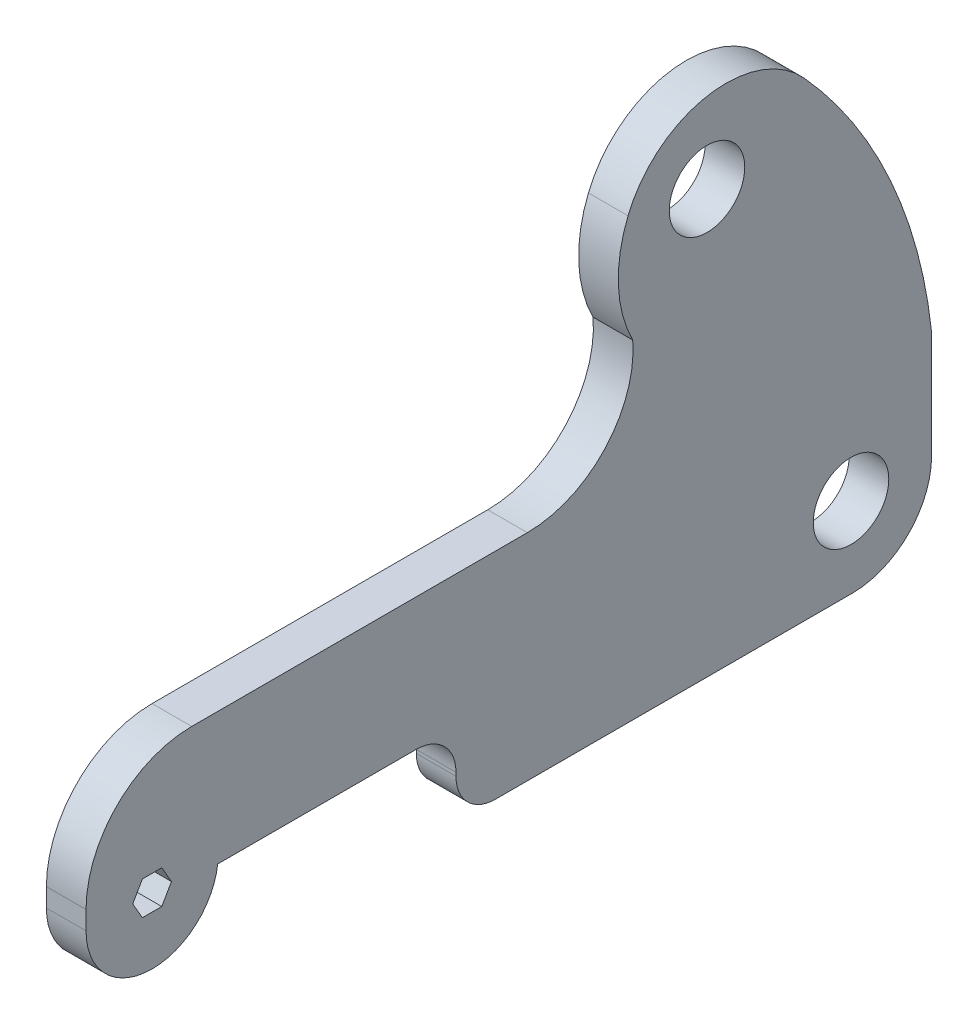
ISO-10303-21;
HEADER;
FILE_DESCRIPTION(('STEP AP214'),'2;1');
FILE_NAME('part.step','',(''),(''),'','','');
FILE_SCHEMA(('AUTOMOTIVE_DESIGN { 1 0 10303 214 1 1 1 1 }'));
ENDSEC;
DATA;
#1=APPLICATION_CONTEXT('core data for automotive mechanical design processes');
#2=APPLICATION_PROTOCOL_DEFINITION('international standard','automotive_design',2000,#1);
#3=PRODUCT_CONTEXT('',#1,'mechanical');
#4=PRODUCT('Part','Part','',(#3));
#5=PRODUCT_RELATED_PRODUCT_CATEGORY('part','',(#4));
#6=PRODUCT_DEFINITION_FORMATION('','',#4);
#7=PRODUCT_DEFINITION_CONTEXT('part definition',#1,'design');
#8=PRODUCT_DEFINITION('design','',#6,#7);
#9=PRODUCT_DEFINITION_SHAPE('','',#8);
#10=(LENGTH_UNIT() NAMED_UNIT(*) SI_UNIT(.MILLI.,.METRE.));
#11=(NAMED_UNIT(*) PLANE_ANGLE_UNIT() SI_UNIT($,.RADIAN.));
#12=(NAMED_UNIT(*) SI_UNIT($,.STERADIAN.) SOLID_ANGLE_UNIT());
#13=UNCERTAINTY_MEASURE_WITH_UNIT(LENGTH_MEASURE(1.E-05),#10,'distance_accuracy_value','');
#14=(GEOMETRIC_REPRESENTATION_CONTEXT(3) GLOBAL_UNCERTAINTY_ASSIGNED_CONTEXT((#13)) GLOBAL_UNIT_ASSIGNED_CONTEXT((#10,
#11,#12)) REPRESENTATION_CONTEXT('',''));
#15=CARTESIAN_POINT('',(0.,0.,0.));
#16=DIRECTION('',(0.,0.,1.));
#17=DIRECTION('',(1.,0.,0.));
#18=AXIS2_PLACEMENT_3D('',#15,#16,#17);
#19=CARTESIAN_POINT('',(15.,25.4000000000001,-90.));
#20=DIRECTION('',(1.,0.,0.));
#21=DIRECTION('',(0.,0.,-1.));
#22=AXIS2_PLACEMENT_3D('',#19,#20,#21);
#23=PLANE('',#22);
#24=DIRECTION('',(0.,0.866025403784439,0.499999999999999));
#25=VECTOR('',#24,1.);
#26=CARTESIAN_POINT('',(15.,19.05,-86.3338257906459));
#27=LINE('',#26,#25);
#28=CARTESIAN_POINT('',(15.,19.05,-86.3338257906459));
#29=VERTEX_POINT('',#28);
#30=CARTESIAN_POINT('',(15.,25.4,-82.6676515812918));
#31=VERTEX_POINT('',#30);
#32=EDGE_CURVE('E292',#29,#31,#27,.T.);
#33=ORIENTED_EDGE('',*,*,#32,.T.);
#34=DIRECTION('',(0.,0.866025403784439,-0.5));
#35=VECTOR('',#34,1.);
#36=CARTESIAN_POINT('',(15.,25.4,-82.6676515812918));
#37=LINE('',#36,#35);
#38=CARTESIAN_POINT('',(15.,31.75,-86.3338257906459));
#39=VERTEX_POINT('',#38);
#40=EDGE_CURVE('E295',#31,#39,#37,.T.);
#41=ORIENTED_EDGE('',*,*,#40,.T.);
#42=DIRECTION('',(0.,0.,-1.));
#43=VECTOR('',#42,1.);
#44=CARTESIAN_POINT('',(15.,31.75,-86.3338257906459));
#45=LINE('',#44,#43);
#46=CARTESIAN_POINT('',(15.,31.75,-93.6661742093541));
#47=VERTEX_POINT('',#46);
#48=EDGE_CURVE('E299',#39,#47,#45,.T.);
#49=ORIENTED_EDGE('',*,*,#48,.T.);
#50=DIRECTION('',(0.,-0.866025403784439,-0.5));
#51=VECTOR('',#50,1.);
#52=CARTESIAN_POINT('',(15.,31.75,-93.6661742093541));
#53=LINE('',#52,#51);
#54=CARTESIAN_POINT('',(15.,25.4,-97.3323484187082));
#55=VERTEX_POINT('',#54);
#56=EDGE_CURVE('E302',#47,#55,#53,.T.);
#57=ORIENTED_EDGE('',*,*,#56,.T.);
#58=DIRECTION('',(0.,-0.866025403784439,0.5));
#59=VECTOR('',#58,1.);
#60=CARTESIAN_POINT('',(15.,25.4,-97.3323484187082));
#61=LINE('',#60,#59);
#62=CARTESIAN_POINT('',(15.,19.05,-93.6661742093541));
#63=VERTEX_POINT('',#62);
#64=EDGE_CURVE('E305',#55,#63,#61,.T.);
#65=ORIENTED_EDGE('',*,*,#64,.T.);
#66=DIRECTION('',(0.,0.,1.));
#67=VECTOR('',#66,1.);
#68=CARTESIAN_POINT('',(15.,19.05,-93.6661742093541));
#69=LINE('',#68,#67);
#70=EDGE_CURVE('E308',#63,#29,#69,.T.);
#71=ORIENTED_EDGE('',*,*,#70,.T.);
#72=EDGE_LOOP('',(#33,#41,#49,#57,#65,#71));
#73=FACE_BOUND('',#72,.T.);
#74=CARTESIAN_POINT('',(15.,21.5616228227509,-354.499999997544));
#75=DIRECTION('',(1.,0.,0.));
#76=DIRECTION('',(0.,0.,-1.));
#77=AXIS2_PLACEMENT_3D('',#74,#75,#76);
#78=CIRCLE('',#77,14.29);
#79=CARTESIAN_POINT('',(15.,21.5616228227509,-368.789999997544));
#80=VERTEX_POINT('',#79);
#81=EDGE_CURVE('E246',#80,#80,#78,.T.);
#82=ORIENTED_EDGE('',*,*,#81,.F.);
#83=EDGE_LOOP('',(#82));
#84=FACE_BOUND('',#83,.T.);
#85=CARTESIAN_POINT('',(15.,151.061622822751,-299.999999997544));
#86=DIRECTION('',(1.,0.,0.));
#87=DIRECTION('',(0.,0.,-1.));
#88=AXIS2_PLACEMENT_3D('',#85,#86,#87);
#89=CIRCLE('',#88,14.2899999999392);
#90=CARTESIAN_POINT('',(15.,151.061622822751,-314.289999997483));
#91=VERTEX_POINT('',#90);
#92=EDGE_CURVE('E247',#91,#91,#89,.T.);
#93=ORIENTED_EDGE('',*,*,#92,.F.);
#94=EDGE_LOOP('',(#93));
#95=FACE_BOUND('',#94,.T.);
#96=CARTESIAN_POINT('',(15.,41.3040957016978,-196.081387122301));
#97=DIRECTION('',(-1.,0.,0.));
#98=DIRECTION('',(0.,0.,-1.));
#99=AXIS2_PLACEMENT_3D('',#96,#97,#98);
#100=CIRCLE('',#99,190.);
#101=CARTESIAN_POINT('',(15.,168.987268489218,-336.783225727603));
#102=VERTEX_POINT('',#101);
#103=CARTESIAN_POINT('',(15.,61.5516614753933,-384.999454231405));
#104=VERTEX_POINT('',#103);
#105=EDGE_CURVE('E188',#102,#104,#100,.T.);
#106=ORIENTED_EDGE('',*,*,#105,.F.);
#107=CARTESIAN_POINT('',(15.,142.106600533951,-307.161786021224));
#108=DIRECTION('',(1.,0.,0.));
#109=DIRECTION('',(0.,0.,-1.));
#110=AXIS2_PLACEMENT_3D('',#107,#108,#109);
#111=CIRCLE('',#110,40.);
#112=CARTESIAN_POINT('',(15.,157.195602297835,-270.116920982065));
#113=VERTEX_POINT('',#112);
#114=EDGE_CURVE('E61',#102,#113,#111,.T.);
#115=ORIENTED_EDGE('',*,*,#114,.T.);
#116=CARTESIAN_POINT('',(15.,138.33435009298,-316.423002281013));
#117=DIRECTION('',(-1.,0.,0.));
#118=DIRECTION('',(0.,0.,1.));
#119=AXIS2_PLACEMENT_3D('',#116,#117,#118);
#120=CIRCLE('',#119,50.);
#121=CARTESIAN_POINT('',(15.,115.607077365959,-271.886825139372));
#122=VERTEX_POINT('',#121);
#123=EDGE_CURVE('E283',#122,#113,#120,.T.);
#124=ORIENTED_EDGE('',*,*,#123,.F.);
#125=CARTESIAN_POINT('',(15.,112.4,-232.015599239373));
#126=DIRECTION('',(1.,0.,0.));
#127=DIRECTION('',(0.,0.,-1.));
#128=AXIS2_PLACEMENT_3D('',#125,#126,#127);
#129=CIRCLE('',#128,40.);
#130=CARTESIAN_POINT('',(15.,72.4,-232.015599239373));
#131=VERTEX_POINT('',#130);
#132=EDGE_CURVE('E258',#122,#131,#129,.F.);
#133=ORIENTED_EDGE('',*,*,#132,.T.);
#134=DIRECTION('',(0.,0.,-1.));
#135=VECTOR('',#134,1.);
#136=CARTESIAN_POINT('',(15.,72.4,-65.));
#137=LINE('',#136,#135);
#138=CARTESIAN_POINT('',(15.,72.4,-105.));
#139=VERTEX_POINT('',#138);
#140=EDGE_CURVE('E205',#139,#131,#137,.T.);
#141=ORIENTED_EDGE('',*,*,#140,.F.);
#142=CARTESIAN_POINT('',(15.,32.4000000000001,-105.));
#143=DIRECTION('',(1.,0.,0.));
#144=DIRECTION('',(0.,0.,-1.));
#145=AXIS2_PLACEMENT_3D('',#142,#143,#144);
#146=CIRCLE('',#145,40.);
#147=CARTESIAN_POINT('',(15.,32.4000000000001,-65.));
#148=VERTEX_POINT('',#147);
#149=EDGE_CURVE('E252',#139,#148,#146,.T.);
#150=ORIENTED_EDGE('',*,*,#149,.T.);
#151=DIRECTION('',(0.,1.,0.));
#152=VECTOR('',#151,1.);
#153=CARTESIAN_POINT('',(15.,25.4,-65.));
#154=LINE('',#153,#152);
#155=CARTESIAN_POINT('',(15.,25.4,-65.));
#156=VERTEX_POINT('',#155);
#157=EDGE_CURVE('E353',#156,#148,#154,.T.);
#158=ORIENTED_EDGE('',*,*,#157,.F.);
#159=CARTESIAN_POINT('',(15.,25.4000000000001,-90.));
#160=DIRECTION('',(1.,0.,0.));
#161=DIRECTION('',(0.,0.,-1.));
#162=AXIS2_PLACEMENT_3D('',#159,#160,#161);
#163=CIRCLE('',#162,25.);
#164=CARTESIAN_POINT('',(15.,22.4000000000001,-114.819347291982));
#165=VERTEX_POINT('',#164);
#166=EDGE_CURVE('E340',#156,#165,#163,.T.);
#167=ORIENTED_EDGE('',*,*,#166,.T.);
#168=DIRECTION('',(0.,0.,1.));
#169=VECTOR('',#168,1.);
#170=CARTESIAN_POINT('',(15.,22.4000000000001,-115.));
#171=LINE('',#170,#169);
#172=CARTESIAN_POINT('',(15.,22.4000000000001,-190.));
#173=VERTEX_POINT('',#172);
#174=EDGE_CURVE('E343',#173,#165,#171,.T.);
#175=ORIENTED_EDGE('',*,*,#174,.F.);
#176=CARTESIAN_POINT('',(15.,7.40000000000005,-190.));
#177=DIRECTION('',(1.,0.,0.));
#178=DIRECTION('',(0.,0.,-1.));
#179=AXIS2_PLACEMENT_3D('',#176,#177,#178);
#180=CIRCLE('',#179,15.);
#181=CARTESIAN_POINT('',(15.,7.40000000000005,-205.));
#182=VERTEX_POINT('',#181);
#183=EDGE_CURVE('E231',#173,#182,#180,.F.);
#184=ORIENTED_EDGE('',*,*,#183,.T.);
#185=DIRECTION('',(0.,-1.,0.));
#186=VECTOR('',#185,1.);
#187=CARTESIAN_POINT('',(15.,22.4000000000001,-205.));
#188=LINE('',#187,#186);
#189=CARTESIAN_POINT('',(15.,6.06162282000004,-205.));
#190=VERTEX_POINT('',#189);
#191=EDGE_CURVE('E346',#182,#190,#188,.T.);
#192=ORIENTED_EDGE('',*,*,#191,.T.);
#193=CARTESIAN_POINT('',(15.,6.06162282000004,-220.));
#194=DIRECTION('',(1.,0.,0.));
#195=DIRECTION('',(0.,0.,-1.));
#196=AXIS2_PLACEMENT_3D('',#193,#194,#195);
#197=CIRCLE('',#196,15.);
#198=CARTESIAN_POINT('',(15.,-8.93837717999996,-220.));
#199=VERTEX_POINT('',#198);
#200=EDGE_CURVE('E227',#190,#199,#197,.T.);
#201=ORIENTED_EDGE('',*,*,#200,.T.);
#202=DIRECTION('',(0.,0.,-1.));
#203=VECTOR('',#202,1.);
#204=CARTESIAN_POINT('',(15.,-8.93837717999996,-205.));
#205=LINE('',#204,#203);
#206=CARTESIAN_POINT('',(15.,-8.93837717999996,-355.));
#207=VERTEX_POINT('',#206);
#208=EDGE_CURVE('E349',#199,#207,#205,.T.);
#209=ORIENTED_EDGE('',*,*,#208,.T.);
#210=CARTESIAN_POINT('',(15.,21.06162282,-355.));
#211=DIRECTION('',(1.,0.,0.));
#212=DIRECTION('',(0.,0.,-1.));
#213=AXIS2_PLACEMENT_3D('',#210,#211,#212);
#214=CIRCLE('',#213,30.);
#215=CARTESIAN_POINT('',(15.,21.06162282,-385.));
#216=VERTEX_POINT('',#215);
#217=EDGE_CURVE('E240',#207,#216,#214,.T.);
#218=ORIENTED_EDGE('',*,*,#217,.T.);
#219=DIRECTION('',(0.,-1.,0.));
#220=VECTOR('',#219,1.);
#221=CARTESIAN_POINT('',(15.,281.06162282,-385.));
#222=LINE('',#221,#220);
#223=CARTESIAN_POINT('',(15.,61.0616228200001,-385.));
#224=VERTEX_POINT('',#223);
#225=EDGE_CURVE('E209',#224,#216,#222,.T.);
#226=ORIENTED_EDGE('',*,*,#225,.F.);
#227=CARTESIAN_POINT('',(15.,61.06162282,-165.));
#228=DIRECTION('',(1.,0.,0.));
#229=DIRECTION('',(0.,0.,-1.));
#230=AXIS2_PLACEMENT_3D('',#227,#228,#229);
#231=CIRCLE('',#230,220.);
#232=EDGE_CURVE('E203',#224,#104,#231,.T.);
#233=ORIENTED_EDGE('',*,*,#232,.T.);
#234=EDGE_LOOP('',(#106,#115,#124,#133,#141,#150,#158,#167,#175,#184,#192,#201,#209,#218,#226,#233));
#235=FACE_BOUND('',#234,.T.);
#236=ADVANCED_FACE('F39',(#73,#84,#95,#235),#23,.T.);
#237=CARTESIAN_POINT('',(0.,25.4000000000001,-90.));
#238=DIRECTION('',(1.,0.,0.));
#239=DIRECTION('',(0.,0.,-1.));
#240=AXIS2_PLACEMENT_3D('',#237,#238,#239);
#241=PLANE('',#240);
#242=CARTESIAN_POINT('',(0.,151.061622822751,-299.999999997544));
#243=DIRECTION('',(1.,0.,0.));
#244=DIRECTION('',(0.,0.,-1.));
#245=AXIS2_PLACEMENT_3D('',#242,#243,#244);
#246=CIRCLE('',#245,14.2899999999392);
#247=CARTESIAN_POINT('',(0.,151.061622822751,-314.289999997483));
#248=VERTEX_POINT('',#247);
#249=EDGE_CURVE('E243',#248,#248,#246,.T.);
#250=ORIENTED_EDGE('',*,*,#249,.T.);
#251=EDGE_LOOP('',(#250));
#252=FACE_BOUND('',#251,.T.);
#253=CARTESIAN_POINT('',(0.,21.5616228227509,-354.499999997544));
#254=DIRECTION('',(1.,0.,0.));
#255=DIRECTION('',(0.,0.,-1.));
#256=AXIS2_PLACEMENT_3D('',#253,#254,#255);
#257=CIRCLE('',#256,14.29);
#258=CARTESIAN_POINT('',(0.,21.5616228227509,-368.789999997544));
#259=VERTEX_POINT('',#258);
#260=EDGE_CURVE('E286',#259,#259,#257,.T.);
#261=ORIENTED_EDGE('',*,*,#260,.T.);
#262=EDGE_LOOP('',(#261));
#263=FACE_BOUND('',#262,.T.);
#264=DIRECTION('',(0.,0.866025403784439,-0.5));
#265=VECTOR('',#264,1.);
#266=CARTESIAN_POINT('',(0.,25.4,-82.6676515812918));
#267=LINE('',#266,#265);
#268=CARTESIAN_POINT('',(0.,25.4,-82.6676515812918));
#269=VERTEX_POINT('',#268);
#270=CARTESIAN_POINT('',(0.,31.75,-86.3338257906459));
#271=VERTEX_POINT('',#270);
#272=EDGE_CURVE('E313',#269,#271,#267,.T.);
#273=ORIENTED_EDGE('',*,*,#272,.F.);
#274=DIRECTION('',(0.,0.866025403784439,0.499999999999999));
#275=VECTOR('',#274,1.);
#276=CARTESIAN_POINT('',(0.,19.05,-86.3338257906459));
#277=LINE('',#276,#275);
#278=CARTESIAN_POINT('',(0.,19.05,-86.3338257906459));
#279=VERTEX_POINT('',#278);
#280=EDGE_CURVE('E289',#279,#269,#277,.T.);
#281=ORIENTED_EDGE('',*,*,#280,.F.);
#282=DIRECTION('',(0.,0.,1.));
#283=VECTOR('',#282,1.);
#284=CARTESIAN_POINT('',(0.,19.05,-93.6661742093541));
#285=LINE('',#284,#283);
#286=CARTESIAN_POINT('',(0.,19.05,-93.6661742093541));
#287=VERTEX_POINT('',#286);
#288=EDGE_CURVE('E296',#287,#279,#285,.T.);
#289=ORIENTED_EDGE('',*,*,#288,.F.);
#290=DIRECTION('',(0.,-0.866025403784439,0.5));
#291=VECTOR('',#290,1.);
#292=CARTESIAN_POINT('',(0.,25.4,-97.3323484187082));
#293=LINE('',#292,#291);
#294=CARTESIAN_POINT('',(0.,25.4,-97.3323484187082));
#295=VERTEX_POINT('',#294);
#296=EDGE_CURVE('E322',#295,#287,#293,.T.);
#297=ORIENTED_EDGE('',*,*,#296,.F.);
#298=DIRECTION('',(0.,-0.866025403784439,-0.5));
#299=VECTOR('',#298,1.);
#300=CARTESIAN_POINT('',(0.,31.75,-93.6661742093541));
#301=LINE('',#300,#299);
#302=CARTESIAN_POINT('',(0.,31.75,-93.6661742093541));
#303=VERTEX_POINT('',#302);
#304=EDGE_CURVE('E319',#303,#295,#301,.T.);
#305=ORIENTED_EDGE('',*,*,#304,.F.);
#306=DIRECTION('',(0.,0.,-1.));
#307=VECTOR('',#306,1.);
#308=CARTESIAN_POINT('',(0.,31.75,-86.3338257906459));
#309=LINE('',#308,#307);
#310=EDGE_CURVE('E316',#271,#303,#309,.T.);
#311=ORIENTED_EDGE('',*,*,#310,.F.);
#312=EDGE_LOOP('',(#273,#281,#289,#297,#305,#311));
#313=FACE_BOUND('',#312,.T.);
#314=CARTESIAN_POINT('',(0.,138.33435009298,-316.423002281013));
#315=DIRECTION('',(-1.,0.,0.));
#316=DIRECTION('',(0.,0.,1.));
#317=AXIS2_PLACEMENT_3D('',#314,#315,#316);
#318=CIRCLE('',#317,50.);
#319=CARTESIAN_POINT('',(0.,115.607077365959,-271.886825139372));
#320=VERTEX_POINT('',#319);
#321=CARTESIAN_POINT('',(0.,157.195602297835,-270.116920982065));
#322=VERTEX_POINT('',#321);
#323=EDGE_CURVE('E267',#320,#322,#318,.T.);
#324=ORIENTED_EDGE('',*,*,#323,.T.);
#325=CARTESIAN_POINT('',(0.,142.106600533951,-307.161786021224));
#326=DIRECTION('',(1.,0.,0.));
#327=DIRECTION('',(0.,0.,-1.));
#328=AXIS2_PLACEMENT_3D('',#325,#326,#327);
#329=CIRCLE('',#328,40.);
#330=CARTESIAN_POINT('',(0.,168.987268489218,-336.783225727603));
#331=VERTEX_POINT('',#330);
#332=EDGE_CURVE('E11',#322,#331,#329,.F.);
#333=ORIENTED_EDGE('',*,*,#332,.T.);
#334=CARTESIAN_POINT('',(0.,41.3040957016978,-196.081387122301));
#335=DIRECTION('',(-1.,0.,0.));
#336=DIRECTION('',(0.,0.,-1.));
#337=AXIS2_PLACEMENT_3D('',#334,#335,#336);
#338=CIRCLE('',#337,190.);
#339=CARTESIAN_POINT('',(0.,61.5516614753933,-384.999454231405));
#340=VERTEX_POINT('',#339);
#341=EDGE_CURVE('E197',#331,#340,#338,.T.);
#342=ORIENTED_EDGE('',*,*,#341,.T.);
#343=CARTESIAN_POINT('',(0.,61.06162282,-165.));
#344=DIRECTION('',(1.,0.,0.));
#345=DIRECTION('',(0.,0.,-1.));
#346=AXIS2_PLACEMENT_3D('',#343,#344,#345);
#347=CIRCLE('',#346,220.);
#348=CARTESIAN_POINT('',(0.,61.0616228200001,-385.));
#349=VERTEX_POINT('',#348);
#350=EDGE_CURVE('E204',#340,#349,#347,.F.);
#351=ORIENTED_EDGE('',*,*,#350,.T.);
#352=DIRECTION('',(0.,-1.,0.));
#353=VECTOR('',#352,1.);
#354=CARTESIAN_POINT('',(0.,281.06162282,-385.));
#355=LINE('',#354,#353);
#356=CARTESIAN_POINT('',(0.,21.06162282,-385.));
#357=VERTEX_POINT('',#356);
#358=EDGE_CURVE('E368',#349,#357,#355,.T.);
#359=ORIENTED_EDGE('',*,*,#358,.T.);
#360=CARTESIAN_POINT('',(0.,21.06162282,-355.));
#361=DIRECTION('',(1.,0.,0.));
#362=DIRECTION('',(0.,0.,-1.));
#363=AXIS2_PLACEMENT_3D('',#360,#361,#362);
#364=CIRCLE('',#363,30.);
#365=CARTESIAN_POINT('',(0.,-8.93837717999996,-355.));
#366=VERTEX_POINT('',#365);
#367=EDGE_CURVE('E236',#357,#366,#364,.F.);
#368=ORIENTED_EDGE('',*,*,#367,.T.);
#369=DIRECTION('',(0.,0.,-1.));
#370=VECTOR('',#369,1.);
#371=CARTESIAN_POINT('',(0.,-8.93837717999996,-205.));
#372=LINE('',#371,#370);
#373=CARTESIAN_POINT('',(0.,-8.93837717999996,-220.));
#374=VERTEX_POINT('',#373);
#375=EDGE_CURVE('E365',#374,#366,#372,.T.);
#376=ORIENTED_EDGE('',*,*,#375,.F.);
#377=CARTESIAN_POINT('',(0.,6.06162282000004,-220.));
#378=DIRECTION('',(1.,0.,0.));
#379=DIRECTION('',(0.,0.,-1.));
#380=AXIS2_PLACEMENT_3D('',#377,#378,#379);
#381=CIRCLE('',#380,15.);
#382=CARTESIAN_POINT('',(0.,6.06162282000004,-205.));
#383=VERTEX_POINT('',#382);
#384=EDGE_CURVE('E225',#374,#383,#381,.F.);
#385=ORIENTED_EDGE('',*,*,#384,.T.);
#386=DIRECTION('',(0.,-1.,0.));
#387=VECTOR('',#386,1.);
#388=CARTESIAN_POINT('',(0.,22.4000000000001,-205.));
#389=LINE('',#388,#387);
#390=CARTESIAN_POINT('',(0.,7.40000000000005,-205.));
#391=VERTEX_POINT('',#390);
#392=EDGE_CURVE('E362',#391,#383,#389,.T.);
#393=ORIENTED_EDGE('',*,*,#392,.F.);
#394=CARTESIAN_POINT('',(0.,7.40000000000005,-190.));
#395=DIRECTION('',(1.,0.,0.));
#396=DIRECTION('',(0.,0.,-1.));
#397=AXIS2_PLACEMENT_3D('',#394,#395,#396);
#398=CIRCLE('',#397,15.);
#399=CARTESIAN_POINT('',(0.,22.4000000000001,-190.));
#400=VERTEX_POINT('',#399);
#401=EDGE_CURVE('E229',#391,#400,#398,.T.);
#402=ORIENTED_EDGE('',*,*,#401,.T.);
#403=DIRECTION('',(0.,0.,-1.));
#404=VECTOR('',#403,1.);
#405=CARTESIAN_POINT('',(0.,22.4000000000001,-115.));
#406=LINE('',#405,#404);
#407=CARTESIAN_POINT('',(0.,22.4000000000001,-114.819347291982));
#408=VERTEX_POINT('',#407);
#409=EDGE_CURVE('E359',#408,#400,#406,.T.);
#410=ORIENTED_EDGE('',*,*,#409,.F.);
#411=CARTESIAN_POINT('',(0.,25.4000000000001,-90.));
#412=DIRECTION('',(1.,0.,0.));
#413=DIRECTION('',(0.,0.,-1.));
#414=AXIS2_PLACEMENT_3D('',#411,#412,#413);
#415=CIRCLE('',#414,25.);
#416=CARTESIAN_POINT('',(0.,25.4,-65.));
#417=VERTEX_POINT('',#416);
#418=EDGE_CURVE('E329',#417,#408,#415,.T.);
#419=ORIENTED_EDGE('',*,*,#418,.F.);
#420=DIRECTION('',(0.,1.,0.));
#421=VECTOR('',#420,1.);
#422=CARTESIAN_POINT('',(0.,25.4,-65.));
#423=LINE('',#422,#421);
#424=CARTESIAN_POINT('',(0.,32.4000000000001,-65.));
#425=VERTEX_POINT('',#424);
#426=EDGE_CURVE('E344',#417,#425,#423,.T.);
#427=ORIENTED_EDGE('',*,*,#426,.T.);
#428=CARTESIAN_POINT('',(0.,32.4000000000001,-105.));
#429=DIRECTION('',(1.,0.,0.));
#430=DIRECTION('',(0.,0.,-1.));
#431=AXIS2_PLACEMENT_3D('',#428,#429,#430);
#432=CIRCLE('',#431,40.);
#433=CARTESIAN_POINT('',(0.,72.4,-105.));
#434=VERTEX_POINT('',#433);
#435=EDGE_CURVE('E256',#425,#434,#432,.F.);
#436=ORIENTED_EDGE('',*,*,#435,.T.);
#437=DIRECTION('',(0.,0.,-1.));
#438=VECTOR('',#437,1.);
#439=CARTESIAN_POINT('',(0.,72.4,-65.));
#440=LINE('',#439,#438);
#441=CARTESIAN_POINT('',(0.,72.4,-232.015599239373));
#442=VERTEX_POINT('',#441);
#443=EDGE_CURVE('E270',#434,#442,#440,.T.);
#444=ORIENTED_EDGE('',*,*,#443,.T.);
#445=CARTESIAN_POINT('',(0.,112.4,-232.015599239373));
#446=DIRECTION('',(1.,0.,0.));
#447=DIRECTION('',(0.,0.,-1.));
#448=AXIS2_PLACEMENT_3D('',#445,#446,#447);
#449=CIRCLE('',#448,40.);
#450=EDGE_CURVE('E260',#442,#320,#449,.T.);
#451=ORIENTED_EDGE('',*,*,#450,.T.);
#452=EDGE_LOOP('',(#324,#333,#342,#351,#359,#368,#376,#385,#393,#402,#410,#419,#427,#436,#444,#451));
#453=FACE_BOUND('',#452,.T.);
#454=ADVANCED_FACE('F266',(#252,#263,#313,#453),#241,.F.);
#455=CARTESIAN_POINT('',(15.,61.06162282,-165.));
#456=DIRECTION('',(-1.,0.,0.));
#457=DIRECTION('',(0.,0.,1.));
#458=AXIS2_PLACEMENT_3D('',#455,#456,#457);
#459=CYLINDRICAL_SURFACE('',#458,220.);
#460=DIRECTION('',(1.,0.,0.));
#461=VECTOR('',#460,1.);
#462=CARTESIAN_POINT('',(7.5,61.5516614753933,-384.999454231405));
#463=LINE('',#462,#461);
#464=EDGE_CURVE('E192',#104,#340,#463,.F.);
#465=ORIENTED_EDGE('',*,*,#464,.F.);
#466=ORIENTED_EDGE('',*,*,#232,.F.);
#467=DIRECTION('',(-1.,0.,0.));
#468=VECTOR('',#467,1.);
#469=CARTESIAN_POINT('',(15.,61.0616228200001,-385.));
#470=LINE('',#469,#468);
#471=EDGE_CURVE('E211',#349,#224,#470,.F.);
#472=ORIENTED_EDGE('',*,*,#471,.F.);
#473=ORIENTED_EDGE('',*,*,#350,.F.);
#474=EDGE_LOOP('',(#465,#466,#472,#473));
#475=FACE_BOUND('',#474,.T.);
#476=ADVANCED_FACE('F201',(#475),#459,.T.);
#477=CARTESIAN_POINT('',(15.,25.4000000000001,-90.));
#478=DIRECTION('',(-1.,0.,0.));
#479=DIRECTION('',(0.,0.,1.));
#480=AXIS2_PLACEMENT_3D('',#477,#478,#479);
#481=CYLINDRICAL_SURFACE('',#480,25.);
#482=ORIENTED_EDGE('',*,*,#418,.T.);
#483=DIRECTION('',(-1.,0.,0.));
#484=VECTOR('',#483,1.);
#485=CARTESIAN_POINT('',(15.,22.4000000000001,-114.819347291982));
#486=LINE('',#485,#484);
#487=EDGE_CURVE('E374',#165,#408,#486,.T.);
#488=ORIENTED_EDGE('',*,*,#487,.F.);
#489=ORIENTED_EDGE('',*,*,#166,.F.);
#490=DIRECTION('',(-1.,0.,0.));
#491=VECTOR('',#490,1.);
#492=CARTESIAN_POINT('',(15.,25.4,-65.));
#493=LINE('',#492,#491);
#494=EDGE_CURVE('E356',#156,#417,#493,.T.);
#495=ORIENTED_EDGE('',*,*,#494,.T.);
#496=EDGE_LOOP('',(#482,#488,#489,#495));
#497=FACE_BOUND('',#496,.T.);
#498=ADVANCED_FACE('F409',(#497),#481,.T.);
#499=CARTESIAN_POINT('',(15.,22.4000000000001,-115.));
#500=DIRECTION('',(0.,1.,0.));
#501=DIRECTION('',(0.,0.,1.));
#502=AXIS2_PLACEMENT_3D('',#499,#500,#501);
#503=PLANE('',#502);
#504=ORIENTED_EDGE('',*,*,#409,.T.);
#505=DIRECTION('',(-1.,0.,0.));
#506=VECTOR('',#505,1.);
#507=CARTESIAN_POINT('',(15.,22.4,-190.));
#508=LINE('',#507,#506);
#509=EDGE_CURVE('E220',#400,#173,#508,.F.);
#510=ORIENTED_EDGE('',*,*,#509,.T.);
#511=ORIENTED_EDGE('',*,*,#174,.T.);
#512=ORIENTED_EDGE('',*,*,#487,.T.);
#513=EDGE_LOOP('',(#504,#510,#511,#512));
#514=FACE_BOUND('',#513,.T.);
#515=ADVANCED_FACE('F404',(#514),#503,.F.);
#516=CARTESIAN_POINT('',(15.,22.4000000000001,-205.));
#517=DIRECTION('',(0.,0.,-1.));
#518=DIRECTION('',(-1.,0.,0.));
#519=AXIS2_PLACEMENT_3D('',#516,#517,#518);
#520=PLANE('',#519);
#521=ORIENTED_EDGE('',*,*,#191,.F.);
#522=DIRECTION('',(-1.,0.,0.));
#523=VECTOR('',#522,1.);
#524=CARTESIAN_POINT('',(0.,7.40000000000005,-205.));
#525=LINE('',#524,#523);
#526=EDGE_CURVE('E213',#182,#391,#525,.T.);
#527=ORIENTED_EDGE('',*,*,#526,.T.);
#528=ORIENTED_EDGE('',*,*,#392,.T.);
#529=DIRECTION('',(-1.,0.,0.));
#530=VECTOR('',#529,1.);
#531=CARTESIAN_POINT('',(15.,6.06162282000004,-205.));
#532=LINE('',#531,#530);
#533=EDGE_CURVE('E210',#383,#190,#532,.F.);
#534=ORIENTED_EDGE('',*,*,#533,.T.);
#535=EDGE_LOOP('',(#521,#527,#528,#534));
#536=FACE_BOUND('',#535,.T.);
#537=ADVANCED_FACE('F396',(#536),#520,.F.);
#538=CARTESIAN_POINT('',(15.,-8.93837717999996,-205.));
#539=DIRECTION('',(0.,1.,0.));
#540=DIRECTION('',(0.,0.,1.));
#541=AXIS2_PLACEMENT_3D('',#538,#539,#540);
#542=PLANE('',#541);
#543=ORIENTED_EDGE('',*,*,#375,.T.);
#544=DIRECTION('',(-1.,0.,0.));
#545=VECTOR('',#544,1.);
#546=CARTESIAN_POINT('',(15.,-8.93837717999996,-355.));
#547=LINE('',#546,#545);
#548=EDGE_CURVE('E238',#366,#207,#547,.F.);
#549=ORIENTED_EDGE('',*,*,#548,.T.);
#550=ORIENTED_EDGE('',*,*,#208,.F.);
#551=DIRECTION('',(-1.,0.,0.));
#552=VECTOR('',#551,1.);
#553=CARTESIAN_POINT('',(15.,-8.93837717999996,-220.));
#554=LINE('',#553,#552);
#555=EDGE_CURVE('E222',#199,#374,#554,.T.);
#556=ORIENTED_EDGE('',*,*,#555,.T.);
#557=EDGE_LOOP('',(#543,#549,#550,#556));
#558=FACE_BOUND('',#557,.T.);
#559=ADVANCED_FACE('F386',(#558),#542,.F.);
#560=CARTESIAN_POINT('',(15.,281.06162282,-385.));
#561=DIRECTION('',(0.,0.,-1.));
#562=DIRECTION('',(0.,1.,0.));
#563=AXIS2_PLACEMENT_3D('',#560,#561,#562);
#564=PLANE('',#563);
#565=ORIENTED_EDGE('',*,*,#225,.T.);
#566=DIRECTION('',(-1.,0.,0.));
#567=VECTOR('',#566,1.);
#568=CARTESIAN_POINT('',(0.,21.06162282,-385.));
#569=LINE('',#568,#567);
#570=EDGE_CURVE('E233',#216,#357,#569,.T.);
#571=ORIENTED_EDGE('',*,*,#570,.T.);
#572=ORIENTED_EDGE('',*,*,#358,.F.);
#573=ORIENTED_EDGE('',*,*,#471,.T.);
#574=EDGE_LOOP('',(#565,#571,#572,#573));
#575=FACE_BOUND('',#574,.T.);
#576=ADVANCED_FACE('F378',(#575),#564,.T.);
#577=CARTESIAN_POINT('',(15.,25.4,-65.));
#578=DIRECTION('',(0.,0.,1.));
#579=DIRECTION('',(1.,0.,0.));
#580=AXIS2_PLACEMENT_3D('',#577,#578,#579);
#581=PLANE('',#580);
#582=ORIENTED_EDGE('',*,*,#157,.T.);
#583=DIRECTION('',(1.,0.,0.));
#584=VECTOR('',#583,1.);
#585=CARTESIAN_POINT('',(0.,32.4000000000001,-65.));
#586=LINE('',#585,#584);
#587=EDGE_CURVE('E254',#148,#425,#586,.F.);
#588=ORIENTED_EDGE('',*,*,#587,.T.);
#589=ORIENTED_EDGE('',*,*,#426,.F.);
#590=ORIENTED_EDGE('',*,*,#494,.F.);
#591=EDGE_LOOP('',(#582,#588,#589,#590));
#592=FACE_BOUND('',#591,.T.);
#593=ADVANCED_FACE('F413',(#592),#581,.T.);
#594=CARTESIAN_POINT('',(15.,19.05,-86.3338257906459));
#595=DIRECTION('',(0.,-0.499999999999999,0.866025403784439));
#596=DIRECTION('',(0.,-0.866025403784439,-0.499999999999999));
#597=AXIS2_PLACEMENT_3D('',#594,#595,#596);
#598=PLANE('',#597);
#599=ORIENTED_EDGE('',*,*,#280,.T.);
#600=DIRECTION('',(-1.,0.,0.));
#601=VECTOR('',#600,1.);
#602=CARTESIAN_POINT('',(15.,25.4,-82.6676515812918));
#603=LINE('',#602,#601);
#604=EDGE_CURVE('E311',#31,#269,#603,.T.);
#605=ORIENTED_EDGE('',*,*,#604,.F.);
#606=ORIENTED_EDGE('',*,*,#32,.F.);
#607=DIRECTION('',(-1.,0.,0.));
#608=VECTOR('',#607,1.);
#609=CARTESIAN_POINT('',(15.,19.05,-86.3338257906459));
#610=LINE('',#609,#608);
#611=EDGE_CURVE('E327',#29,#279,#610,.T.);
#612=ORIENTED_EDGE('',*,*,#611,.T.);
#613=EDGE_LOOP('',(#599,#605,#606,#612));
#614=FACE_BOUND('',#613,.T.);
#615=ADVANCED_FACE('F441',(#614),#598,.F.);
#616=CARTESIAN_POINT('',(15.,19.05,-93.6661742093541));
#617=DIRECTION('',(0.,-1.,0.));
#618=DIRECTION('',(0.,0.,-1.));
#619=AXIS2_PLACEMENT_3D('',#616,#617,#618);
#620=PLANE('',#619);
#621=ORIENTED_EDGE('',*,*,#288,.T.);
#622=ORIENTED_EDGE('',*,*,#611,.F.);
#623=ORIENTED_EDGE('',*,*,#70,.F.);
#624=DIRECTION('',(-1.,0.,0.));
#625=VECTOR('',#624,1.);
#626=CARTESIAN_POINT('',(15.,19.05,-93.6661742093541));
#627=LINE('',#626,#625);
#628=EDGE_CURVE('E330',#63,#287,#627,.T.);
#629=ORIENTED_EDGE('',*,*,#628,.T.);
#630=EDGE_LOOP('',(#621,#622,#623,#629));
#631=FACE_BOUND('',#630,.T.);
#632=ADVANCED_FACE('F547',(#631),#620,.F.);
#633=CARTESIAN_POINT('',(15.,25.4,-97.3323484187082));
#634=DIRECTION('',(0.,-0.5,-0.866025403784438));
#635=DIRECTION('',(0.,0.866025403784439,-0.5));
#636=AXIS2_PLACEMENT_3D('',#633,#634,#635);
#637=PLANE('',#636);
#638=ORIENTED_EDGE('',*,*,#296,.T.);
#639=ORIENTED_EDGE('',*,*,#628,.F.);
#640=ORIENTED_EDGE('',*,*,#64,.F.);
#641=DIRECTION('',(-1.,0.,0.));
#642=VECTOR('',#641,1.);
#643=CARTESIAN_POINT('',(15.,25.4,-97.3323484187082));
#644=LINE('',#643,#642);
#645=EDGE_CURVE('E332',#55,#295,#644,.T.);
#646=ORIENTED_EDGE('',*,*,#645,.T.);
#647=EDGE_LOOP('',(#638,#639,#640,#646));
#648=FACE_BOUND('',#647,.T.);
#649=ADVANCED_FACE('F554',(#648),#637,.F.);
#650=CARTESIAN_POINT('',(15.,31.75,-93.6661742093541));
#651=DIRECTION('',(0.,0.5,-0.866025403784439));
#652=DIRECTION('',(0.,0.866025403784439,0.5));
#653=AXIS2_PLACEMENT_3D('',#650,#651,#652);
#654=PLANE('',#653);
#655=ORIENTED_EDGE('',*,*,#304,.T.);
#656=ORIENTED_EDGE('',*,*,#645,.F.);
#657=ORIENTED_EDGE('',*,*,#56,.F.);
#658=DIRECTION('',(-1.,0.,0.));
#659=VECTOR('',#658,1.);
#660=CARTESIAN_POINT('',(15.,31.75,-93.6661742093541));
#661=LINE('',#660,#659);
#662=EDGE_CURVE('E334',#47,#303,#661,.T.);
#663=ORIENTED_EDGE('',*,*,#662,.T.);
#664=EDGE_LOOP('',(#655,#656,#657,#663));
#665=FACE_BOUND('',#664,.T.);
#666=ADVANCED_FACE('F562',(#665),#654,.F.);
#667=CARTESIAN_POINT('',(15.,31.75,-86.3338257906459));
#668=DIRECTION('',(0.,1.,0.));
#669=DIRECTION('',(0.,0.,1.));
#670=AXIS2_PLACEMENT_3D('',#667,#668,#669);
#671=PLANE('',#670);
#672=ORIENTED_EDGE('',*,*,#310,.T.);
#673=ORIENTED_EDGE('',*,*,#662,.F.);
#674=ORIENTED_EDGE('',*,*,#48,.F.);
#675=DIRECTION('',(-1.,0.,0.));
#676=VECTOR('',#675,1.);
#677=CARTESIAN_POINT('',(15.,31.75,-86.3338257906459));
#678=LINE('',#677,#676);
#679=EDGE_CURVE('E336',#39,#271,#678,.T.);
#680=ORIENTED_EDGE('',*,*,#679,.T.);
#681=EDGE_LOOP('',(#672,#673,#674,#680));
#682=FACE_BOUND('',#681,.T.);
#683=ADVANCED_FACE('F570',(#682),#671,.F.);
#684=CARTESIAN_POINT('',(15.,25.4,-82.6676515812918));
#685=DIRECTION('',(0.,0.5,0.866025403784439));
#686=DIRECTION('',(0.,-0.866025403784439,0.5));
#687=AXIS2_PLACEMENT_3D('',#684,#685,#686);
#688=PLANE('',#687);
#689=ORIENTED_EDGE('',*,*,#272,.T.);
#690=ORIENTED_EDGE('',*,*,#679,.F.);
#691=ORIENTED_EDGE('',*,*,#40,.F.);
#692=ORIENTED_EDGE('',*,*,#604,.T.);
#693=EDGE_LOOP('',(#689,#690,#691,#692));
#694=FACE_BOUND('',#693,.T.);
#695=ADVANCED_FACE('F460',(#694),#688,.F.);
#696=CARTESIAN_POINT('',(15.,7.40000000000005,-190.));
#697=DIRECTION('',(1.,0.,0.));
#698=DIRECTION('',(0.,0.,-1.));
#699=AXIS2_PLACEMENT_3D('',#696,#697,#698);
#700=CYLINDRICAL_SURFACE('',#699,15.);
#701=ORIENTED_EDGE('',*,*,#183,.F.);
#702=ORIENTED_EDGE('',*,*,#509,.F.);
#703=ORIENTED_EDGE('',*,*,#401,.F.);
#704=ORIENTED_EDGE('',*,*,#526,.F.);
#705=EDGE_LOOP('',(#701,#702,#703,#704));
#706=FACE_BOUND('',#705,.T.);
#707=ADVANCED_FACE('F400',(#706),#700,.F.);
#708=CARTESIAN_POINT('',(15.,6.06162282000004,-220.));
#709=DIRECTION('',(-1.,0.,0.));
#710=DIRECTION('',(0.,0.,1.));
#711=AXIS2_PLACEMENT_3D('',#708,#709,#710);
#712=CYLINDRICAL_SURFACE('',#711,15.);
#713=ORIENTED_EDGE('',*,*,#200,.F.);
#714=ORIENTED_EDGE('',*,*,#533,.F.);
#715=ORIENTED_EDGE('',*,*,#384,.F.);
#716=ORIENTED_EDGE('',*,*,#555,.F.);
#717=EDGE_LOOP('',(#713,#714,#715,#716));
#718=FACE_BOUND('',#717,.T.);
#719=ADVANCED_FACE('F391',(#718),#712,.T.);
#720=CARTESIAN_POINT('',(15.,21.06162282,-355.));
#721=DIRECTION('',(1.,0.,0.));
#722=DIRECTION('',(0.,0.,-1.));
#723=AXIS2_PLACEMENT_3D('',#720,#721,#722);
#724=CYLINDRICAL_SURFACE('',#723,30.);
#725=ORIENTED_EDGE('',*,*,#217,.F.);
#726=ORIENTED_EDGE('',*,*,#548,.F.);
#727=ORIENTED_EDGE('',*,*,#367,.F.);
#728=ORIENTED_EDGE('',*,*,#570,.F.);
#729=EDGE_LOOP('',(#725,#726,#727,#728));
#730=FACE_BOUND('',#729,.T.);
#731=ADVANCED_FACE('F382',(#730),#724,.T.);
#732=CARTESIAN_POINT('',(0.,21.5616228227509,-354.499999997544));
#733=DIRECTION('',(1.,0.,0.));
#734=DIRECTION('',(0.,0.,-1.));
#735=AXIS2_PLACEMENT_3D('',#732,#733,#734);
#736=CYLINDRICAL_SURFACE('',#735,14.29);
#737=ORIENTED_EDGE('',*,*,#260,.F.);
#738=EDGE_LOOP('',(#737));
#739=FACE_BOUND('',#738,.T.);
#740=ORIENTED_EDGE('',*,*,#81,.T.);
#741=EDGE_LOOP('',(#740));
#742=FACE_BOUND('',#741,.T.);
#743=ADVANCED_FACE('F465',(#739,#742),#736,.F.);
#744=CARTESIAN_POINT('',(-508.,151.061622822751,-299.999999997544));
#745=DIRECTION('',(1.,0.,0.));
#746=DIRECTION('',(0.,0.,-1.));
#747=AXIS2_PLACEMENT_3D('',#744,#745,#746);
#748=CYLINDRICAL_SURFACE('',#747,14.2899999999392);
#749=ORIENTED_EDGE('',*,*,#92,.T.);
#750=EDGE_LOOP('',(#749));
#751=FACE_BOUND('',#750,.T.);
#752=ORIENTED_EDGE('',*,*,#249,.F.);
#753=EDGE_LOOP('',(#752));
#754=FACE_BOUND('',#753,.T.);
#755=ADVANCED_FACE('F492',(#751,#754),#748,.F.);
#756=CARTESIAN_POINT('',(0.,138.33435009298,-316.423002281013));
#757=DIRECTION('',(1.,0.,0.));
#758=DIRECTION('',(0.,0.,-1.));
#759=AXIS2_PLACEMENT_3D('',#756,#757,#758);
#760=CYLINDRICAL_SURFACE('',#759,50.);
#761=ORIENTED_EDGE('',*,*,#123,.T.);
#762=DIRECTION('',(1.,0.,0.));
#763=VECTOR('',#762,1.);
#764=CARTESIAN_POINT('',(0.,157.195602297835,-270.116920982065));
#765=LINE('',#764,#763);
#766=EDGE_CURVE('E47',#113,#322,#765,.F.);
#767=ORIENTED_EDGE('',*,*,#766,.T.);
#768=ORIENTED_EDGE('',*,*,#323,.F.);
#769=DIRECTION('',(1.,0.,0.));
#770=VECTOR('',#769,1.);
#771=CARTESIAN_POINT('',(0.,115.607077365959,-271.886825139372));
#772=LINE('',#771,#770);
#773=EDGE_CURVE('E276',#320,#122,#772,.T.);
#774=ORIENTED_EDGE('',*,*,#773,.T.);
#775=EDGE_LOOP('',(#761,#767,#768,#774));
#776=FACE_BOUND('',#775,.T.);
#777=ADVANCED_FACE('F275',(#776),#760,.T.);
#778=CARTESIAN_POINT('',(0.,72.4,-65.));
#779=DIRECTION('',(0.,-1.,0.));
#780=DIRECTION('',(0.,0.,-1.));
#781=AXIS2_PLACEMENT_3D('',#778,#779,#780);
#782=PLANE('',#781);
#783=ORIENTED_EDGE('',*,*,#140,.T.);
#784=DIRECTION('',(-1.,0.,0.));
#785=VECTOR('',#784,1.);
#786=CARTESIAN_POINT('',(0.,72.4,-232.015599239373));
#787=LINE('',#786,#785);
#788=EDGE_CURVE('E250',#131,#442,#787,.T.);
#789=ORIENTED_EDGE('',*,*,#788,.T.);
#790=ORIENTED_EDGE('',*,*,#443,.F.);
#791=DIRECTION('',(1.,0.,0.));
#792=VECTOR('',#791,1.);
#793=CARTESIAN_POINT('',(15.,72.4,-105.));
#794=LINE('',#793,#792);
#795=EDGE_CURVE('E242',#434,#139,#794,.T.);
#796=ORIENTED_EDGE('',*,*,#795,.T.);
#797=EDGE_LOOP('',(#783,#789,#790,#796));
#798=FACE_BOUND('',#797,.T.);
#799=ADVANCED_FACE('F421',(#798),#782,.F.);
#800=CARTESIAN_POINT('',(0.,112.4,-232.015599239373));
#801=DIRECTION('',(-1.,0.,0.));
#802=DIRECTION('',(0.,0.,1.));
#803=AXIS2_PLACEMENT_3D('',#800,#801,#802);
#804=CYLINDRICAL_SURFACE('',#803,40.);
#805=ORIENTED_EDGE('',*,*,#450,.F.);
#806=ORIENTED_EDGE('',*,*,#788,.F.);
#807=ORIENTED_EDGE('',*,*,#132,.F.);
#808=ORIENTED_EDGE('',*,*,#773,.F.);
#809=EDGE_LOOP('',(#805,#806,#807,#808));
#810=FACE_BOUND('',#809,.T.);
#811=ADVANCED_FACE('F278',(#810),#804,.F.);
#812=CARTESIAN_POINT('',(0.,32.4000000000001,-105.));
#813=DIRECTION('',(-1.,0.,0.));
#814=DIRECTION('',(0.,0.,1.));
#815=AXIS2_PLACEMENT_3D('',#812,#813,#814);
#816=CYLINDRICAL_SURFACE('',#815,40.);
#817=ORIENTED_EDGE('',*,*,#435,.F.);
#818=ORIENTED_EDGE('',*,*,#587,.F.);
#819=ORIENTED_EDGE('',*,*,#149,.F.);
#820=ORIENTED_EDGE('',*,*,#795,.F.);
#821=EDGE_LOOP('',(#817,#818,#819,#820));
#822=FACE_BOUND('',#821,.T.);
#823=ADVANCED_FACE('F417',(#822),#816,.T.);
#824=CARTESIAN_POINT('',(0.,41.3040957016978,-196.081387122301));
#825=DIRECTION('',(1.,0.,0.));
#826=DIRECTION('',(0.,0.,-1.));
#827=AXIS2_PLACEMENT_3D('',#824,#825,#826);
#828=CYLINDRICAL_SURFACE('',#827,190.);
#829=ORIENTED_EDGE('',*,*,#341,.F.);
#830=DIRECTION('',(1.,0.,0.));
#831=VECTOR('',#830,1.);
#832=CARTESIAN_POINT('',(0.,168.987268489218,-336.783225727603));
#833=LINE('',#832,#831);
#834=EDGE_CURVE('E195',#331,#102,#833,.T.);
#835=ORIENTED_EDGE('',*,*,#834,.T.);
#836=ORIENTED_EDGE('',*,*,#105,.T.);
#837=ORIENTED_EDGE('',*,*,#464,.T.);
#838=EDGE_LOOP('',(#829,#835,#836,#837));
#839=FACE_BOUND('',#838,.T.);
#840=ADVANCED_FACE('F191',(#839),#828,.T.);
#841=CARTESIAN_POINT('',(0.,142.106600533951,-307.161786021224));
#842=DIRECTION('',(1.,0.,0.));
#843=DIRECTION('',(0.,0.,-1.));
#844=AXIS2_PLACEMENT_3D('',#841,#842,#843);
#845=CYLINDRICAL_SURFACE('',#844,40.);
#846=ORIENTED_EDGE('',*,*,#332,.F.);
#847=ORIENTED_EDGE('',*,*,#766,.F.);
#848=ORIENTED_EDGE('',*,*,#114,.F.);
#849=ORIENTED_EDGE('',*,*,#834,.F.);
#850=EDGE_LOOP('',(#846,#847,#848,#849));
#851=FACE_BOUND('',#850,.T.);
#852=ADVANCED_FACE('F41',(#851),#845,.T.);
#853=CLOSED_SHELL('',(#236,#454,#476,#498,#515,#537,#559,#576,#593,#615,#632,#649,#666,#683,
#695,#707,#719,#731,#743,#755,#777,#799,#811,#823,#840,#852));
#854=MANIFOLD_SOLID_BREP('B2',#853);
#855=ADVANCED_BREP_SHAPE_REPRESENTATION('',(#18,#854),#14);
#856=SHAPE_DEFINITION_REPRESENTATION(#9,#855);
ENDSEC;
END-ISO-10303-21;
